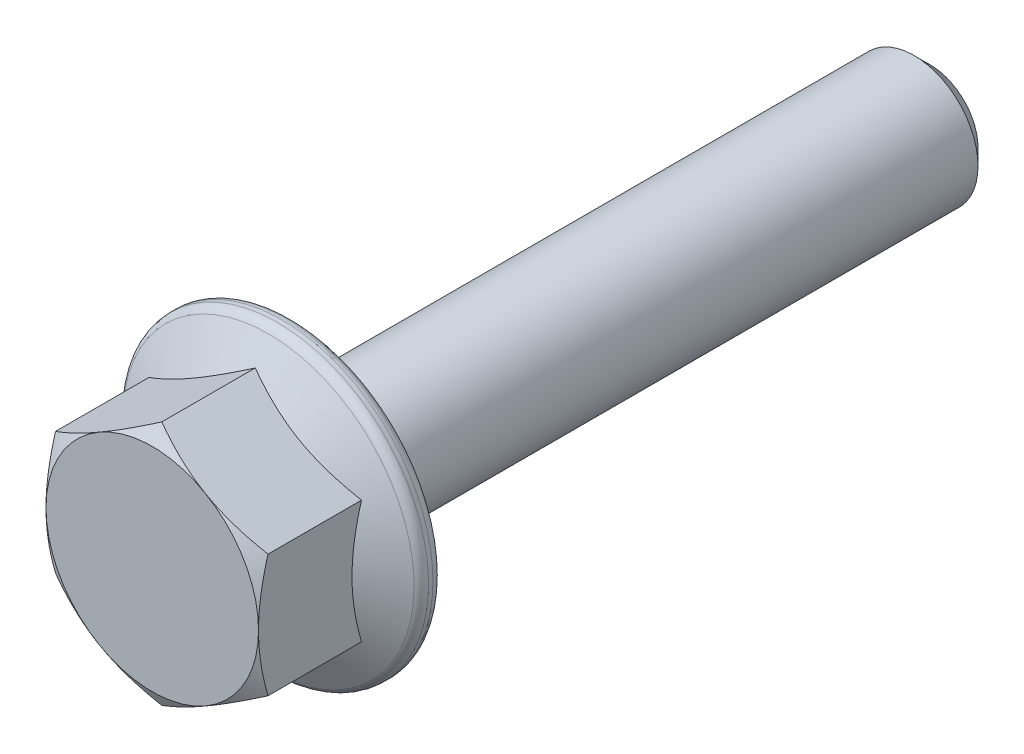
ISO-10303-21;
HEADER;
FILE_DESCRIPTION(('STEP AP214'),'2;1');
FILE_NAME('part.step','',(''),(''),'','','');
FILE_SCHEMA(('AUTOMOTIVE_DESIGN { 1 0 10303 214 1 1 1 1 }'));
ENDSEC;
DATA;
#1=APPLICATION_CONTEXT('core data for automotive mechanical design processes');
#2=APPLICATION_PROTOCOL_DEFINITION('international standard','automotive_design',2000,#1);
#3=PRODUCT_CONTEXT('',#1,'mechanical');
#4=PRODUCT('Part','Part','',(#3));
#5=PRODUCT_RELATED_PRODUCT_CATEGORY('part','',(#4));
#6=PRODUCT_DEFINITION_FORMATION('','',#4);
#7=PRODUCT_DEFINITION_CONTEXT('part definition',#1,'design');
#8=PRODUCT_DEFINITION('design','',#6,#7);
#9=PRODUCT_DEFINITION_SHAPE('','',#8);
#10=(LENGTH_UNIT() NAMED_UNIT(*) SI_UNIT(.MILLI.,.METRE.));
#11=(NAMED_UNIT(*) PLANE_ANGLE_UNIT() SI_UNIT($,.RADIAN.));
#12=(NAMED_UNIT(*) SI_UNIT($,.STERADIAN.) SOLID_ANGLE_UNIT());
#13=UNCERTAINTY_MEASURE_WITH_UNIT(LENGTH_MEASURE(1.E-05),#10,'distance_accuracy_value','');
#14=(GEOMETRIC_REPRESENTATION_CONTEXT(3) GLOBAL_UNCERTAINTY_ASSIGNED_CONTEXT((#13)) GLOBAL_UNIT_ASSIGNED_CONTEXT((#10,
#11,#12)) REPRESENTATION_CONTEXT('',''));
#15=CARTESIAN_POINT('',(0.,0.,0.));
#16=DIRECTION('',(0.,0.,1.));
#17=DIRECTION('',(1.,0.,0.));
#18=AXIS2_PLACEMENT_3D('',#15,#16,#17);
#19=CARTESIAN_POINT('',(5.,-2.88675134594813,0.));
#20=DIRECTION('',(0.,0.,1.));
#21=DIRECTION('',(1.,0.,0.));
#22=AXIS2_PLACEMENT_3D('',#19,#20,#21);
#23=PLANE('',#22);
#24=CARTESIAN_POINT('',(0.,0.,0.));
#25=DIRECTION('',(0.,0.,1.));
#26=DIRECTION('',(1.,0.,0.));
#27=AXIS2_PLACEMENT_3D('',#24,#25,#26);
#28=CIRCLE('',#27,6.605);
#29=CARTESIAN_POINT('',(6.605,0.,0.));
#30=VERTEX_POINT('',#29);
#31=EDGE_CURVE('E350',#30,#30,#28,.F.);
#32=ORIENTED_EDGE('',*,*,#31,.T.);
#33=EDGE_LOOP('',(#32));
#34=FACE_BOUND('',#33,.T.);
#35=CARTESIAN_POINT('',(0.,0.,0.));
#36=DIRECTION('',(0.,0.,1.));
#37=DIRECTION('',(1.,0.,0.));
#38=AXIS2_PLACEMENT_3D('',#35,#36,#37);
#39=CIRCLE('',#38,3.);
#40=CARTESIAN_POINT('',(3.,0.,0.));
#41=VERTEX_POINT('',#40);
#42=EDGE_CURVE('E336',#41,#41,#39,.F.);
#43=ORIENTED_EDGE('',*,*,#42,.F.);
#44=EDGE_LOOP('',(#43));
#45=FACE_BOUND('',#44,.T.);
#46=ADVANCED_FACE('F42',(#34,#45),#23,.F.);
#47=CARTESIAN_POINT('',(0.,0.,0.99));
#48=DIRECTION('',(0.,0.,-1.));
#49=DIRECTION('',(-1.,0.,0.));
#50=AXIS2_PLACEMENT_3D('',#47,#48,#49);
#51=CYLINDRICAL_SURFACE('',#50,7.1);
#52=CARTESIAN_POINT('',(0.,0.,0.495));
#53=DIRECTION('',(0.,0.,1.));
#54=DIRECTION('',(1.,0.,0.));
#55=AXIS2_PLACEMENT_3D('',#52,#53,#54);
#56=CIRCLE('',#55,7.1);
#57=CARTESIAN_POINT('',(7.1,0.,0.495));
#58=VERTEX_POINT('',#57);
#59=EDGE_CURVE('E51',#58,#58,#56,.T.);
#60=ORIENTED_EDGE('',*,*,#59,.T.);
#61=EDGE_LOOP('',(#60));
#62=FACE_BOUND('',#61,.T.);
#63=CARTESIAN_POINT('',(0.,0.,0.704211616751135));
#64=DIRECTION('',(0.,0.,-1.));
#65=DIRECTION('',(-1.,0.,0.));
#66=AXIS2_PLACEMENT_3D('',#63,#64,#65);
#67=CIRCLE('',#66,7.1);
#68=CARTESIAN_POINT('',(-7.1,0.,0.704211616751135));
#69=VERTEX_POINT('',#68);
#70=EDGE_CURVE('E353',#69,#69,#67,.T.);
#71=ORIENTED_EDGE('',*,*,#70,.T.);
#72=EDGE_LOOP('',(#71));
#73=FACE_BOUND('',#72,.T.);
#74=ADVANCED_FACE('F239',(#62,#73),#51,.T.);
#75=CARTESIAN_POINT('',(0.,0.,-30.));
#76=DIRECTION('',(0.,0.,1.));
#77=DIRECTION('',(1.,0.,0.));
#78=AXIS2_PLACEMENT_3D('',#75,#76,#77);
#79=PLANE('',#78);
#80=CARTESIAN_POINT('',(0.,0.,-30.));
#81=DIRECTION('',(0.,0.,1.));
#82=DIRECTION('',(1.,0.,0.));
#83=AXIS2_PLACEMENT_3D('',#80,#81,#82);
#84=CIRCLE('',#83,2.25);
#85=CARTESIAN_POINT('',(2.25,0.,-30.));
#86=VERTEX_POINT('',#85);
#87=EDGE_CURVE('E511',#86,#86,#84,.F.);
#88=ORIENTED_EDGE('',*,*,#87,.T.);
#89=EDGE_LOOP('',(#88));
#90=FACE_BOUND('',#89,.T.);
#91=ADVANCED_FACE('F283',(#90),#79,.F.);
#92=CARTESIAN_POINT('',(0.,0.,-30.));
#93=DIRECTION('',(0.,0.,1.));
#94=DIRECTION('',(1.,0.,0.));
#95=AXIS2_PLACEMENT_3D('',#92,#93,#94);
#96=CYLINDRICAL_SURFACE('',#95,3.);
#97=ORIENTED_EDGE('',*,*,#42,.T.);
#98=EDGE_LOOP('',(#97));
#99=FACE_BOUND('',#98,.T.);
#100=CARTESIAN_POINT('',(0.,0.,-29.25));
#101=DIRECTION('',(0.,0.,1.));
#102=DIRECTION('',(1.,0.,0.));
#103=AXIS2_PLACEMENT_3D('',#100,#101,#102);
#104=CIRCLE('',#103,3.);
#105=CARTESIAN_POINT('',(3.,0.,-29.25));
#106=VERTEX_POINT('',#105);
#107=EDGE_CURVE('E514',#106,#106,#104,.T.);
#108=ORIENTED_EDGE('',*,*,#107,.T.);
#109=EDGE_LOOP('',(#108));
#110=FACE_BOUND('',#109,.T.);
#111=ADVANCED_FACE('F166',(#99,#110),#96,.T.);
#112=CARTESIAN_POINT('',(0.,0.,-29.25));
#113=DIRECTION('',(0.,0.,1.));
#114=DIRECTION('',(1.,0.,0.));
#115=AXIS2_PLACEMENT_3D('',#112,#113,#114);
#116=CONICAL_SURFACE('',#115,3.,0.785398163397449);
#117=ORIENTED_EDGE('',*,*,#87,.F.);
#118=EDGE_LOOP('',(#117));
#119=FACE_BOUND('',#118,.T.);
#120=ORIENTED_EDGE('',*,*,#107,.F.);
#121=EDGE_LOOP('',(#120));
#122=FACE_BOUND('',#121,.T.);
#123=ADVANCED_FACE('F164',(#119,#122),#116,.T.);
#124=CARTESIAN_POINT('',(0.,0.,0.99));
#125=DIRECTION('',(0.,0.,-1.));
#126=DIRECTION('',(1.,0.,0.));
#127=AXIS2_PLACEMENT_3D('',#124,#125,#126);
#128=CONICAL_SURFACE('',#127,7.1,1.0471975511966);
#129=CARTESIAN_POINT('',(0.,0.,1.13289419162443));
#130=DIRECTION('',(0.,0.,-1.));
#131=DIRECTION('',(-1.,0.,0.));
#132=AXIS2_PLACEMENT_3D('',#129,#130,#131);
#133=CIRCLE('',#132,6.8525);
#134=CARTESIAN_POINT('',(-6.8525,0.,1.13289419162443));
#135=VERTEX_POINT('',#134);
#136=EDGE_CURVE('E12',#135,#135,#133,.F.);
#137=ORIENTED_EDGE('',*,*,#136,.T.);
#138=EDGE_LOOP('',(#137));
#139=FACE_BOUND('',#138,.T.);
#140=CARTESIAN_POINT('',(5.,-7.70171820680636,-0.212273998636657));
#141=CARTESIAN_POINT('',(5.,-7.48371447646161,-0.106734717112685));
#142=CARTESIAN_POINT('',(5.,-7.26520450424519,-0.0022229251631863));
#143=CARTESIAN_POINT('',(5.,-6.8269025412551,0.204166509530027));
#144=CARTESIAN_POINT('',(5.,-6.60711034992659,0.306043725876509));
#145=CARTESIAN_POINT('',(5.,-6.1648171866127,0.507108387813601));
#146=CARTESIAN_POINT('',(5.,-5.94230794712741,0.606277710799799));
#147=CARTESIAN_POINT('',(5.,-5.49550054936903,0.800485404375952));
#148=CARTESIAN_POINT('',(5.,-5.27120247796644,0.895523974138073));
#149=CARTESIAN_POINT('',(5.,-4.81354137707359,1.08321501931591));
#150=CARTESIAN_POINT('',(5.,-4.58011130522733,1.17570492548981));
#151=CARTESIAN_POINT('',(5.,-4.11050120983856,1.35355683778659));
#152=CARTESIAN_POINT('',(5.,-3.8743208785309,1.43891803727243));
#153=CARTESIAN_POINT('',(5.,-3.3992933604217,1.60023398047267));
#154=CARTESIAN_POINT('',(5.,-3.1604528555511,1.6762082000866));
#155=CARTESIAN_POINT('',(5.,-2.6793473146327,1.8162783463246));
#156=CARTESIAN_POINT('',(5.,-2.43708339928788,1.8803780675313));
#157=CARTESIAN_POINT('',(5.,-1.95026796729562,1.99326604883031));
#158=CARTESIAN_POINT('',(5.,-1.70573474373274,2.0421317275487));
#159=CARTESIAN_POINT('',(5.,-1.21368437348609,2.12173164280274));
#160=CARTESIAN_POINT('',(5.,-0.96616751023231,2.15246758793047));
#161=CARTESIAN_POINT('',(5.,-0.472597902685094,2.19295289158222));
#162=CARTESIAN_POINT('',(5.,-0.226567511674905,2.20296807199916));
#163=CARTESIAN_POINT('',(5.,0.265466884600938,2.2018593774913));
#164=CARTESIAN_POINT('',(5.,0.511470888568317,2.19073472744314));
#165=CARTESIAN_POINT('',(5.,0.930593929624013,2.15455157716298));
#166=CARTESIAN_POINT('',(5.,1.10416727822158,2.1344675460135));
#167=CARTESIAN_POINT('',(5.,1.4500019226071,2.08505346989829));
#168=CARTESIAN_POINT('',(5.,1.62226303106724,2.0557221292654));
#169=CARTESIAN_POINT('',(5.,2.13686448014456,1.95540338682575));
#170=CARTESIAN_POINT('',(5.,2.47683032272226,1.87211005861612));
#171=CARTESIAN_POINT('',(5.,2.9852924219486,1.72816150260356));
#172=CARTESIAN_POINT('',(5.,3.15643331927305,1.6763209069459));
#173=CARTESIAN_POINT('',(5.,3.49705069568681,1.5673851864987));
#174=CARTESIAN_POINT('',(5.,3.66652716271324,1.51029002365791));
#175=CARTESIAN_POINT('',(5.,4.00387435609743,1.39175094562261));
#176=CARTESIAN_POINT('',(5.,4.17174560324943,1.33030849922685));
#177=CARTESIAN_POINT('',(5.,4.5061034494463,1.20378501750928));
#178=CARTESIAN_POINT('',(5.,4.67259007445492,1.13870405059277));
#179=CARTESIAN_POINT('',(5.,5.1052607424884,0.964996650317399));
#180=CARTESIAN_POINT('',(5.,5.37047839191152,0.853965936328499));
#181=CARTESIAN_POINT('',(5.,5.89837174428201,0.625998387878282));
#182=CARTESIAN_POINT('',(5.,6.16104721755945,0.509061025614777));
#183=CARTESIAN_POINT('',(5.,6.68440643631685,0.270630627228389));
#184=CARTESIAN_POINT('',(5.,6.94508959300766,0.149136302633067));
#185=CARTESIAN_POINT('',(5.,7.46478995692088,-0.0973714657764252));
#186=CARTESIAN_POINT('',(5.,7.72380712045051,-0.222385001427781));
#187=CARTESIAN_POINT('',(5.,8.24082980568644,-0.475356171054078));
#188=CARTESIAN_POINT('',(5.,8.49883349404381,-0.603317544977937));
#189=CARTESIAN_POINT('',(5.,9.01372375142724,-0.861470592477799));
#190=CARTESIAN_POINT('',(5.,9.27061030984767,-0.991662287169942));
#191=CARTESIAN_POINT('',(5.,10.0398008906673,-1.38487592990517));
#192=CARTESIAN_POINT('',(5.,10.5507314385059,-1.65058364477311));
#193=CARTESIAN_POINT('',(5.,11.5196330016532,-2.16032993585003));
#194=CARTESIAN_POINT('',(5.,11.9778447606495,-2.40391300966252));
#195=CARTESIAN_POINT('',(5.,12.8927358525534,-2.89399372912938));
#196=CARTESIAN_POINT('',(5.,13.3494151069724,-3.14049152122468));
#197=CARTESIAN_POINT('',(5.,14.2602606266051,-3.63493653338174));
#198=CARTESIAN_POINT('',(5.,14.7144303358757,-3.88287741859901));
#199=CARTESIAN_POINT('',(5.,15.621810818578,-4.38043638328299));
#200=CARTESIAN_POINT('',(5.,16.0750216543522,-4.63005434901193));
#201=CARTESIAN_POINT('',(4.99999999999999,16.5278911569616,-4.88028626267091));
#202=B_SPLINE_CURVE_WITH_KNOTS('',3,(#140,#141,#142,#143,#144,#145,#146,#147,#148,#149,#150,
#151,#152,#153,#154,#155,#156,#157,#158,#159,#160,#161,#162,#163,#164,#165,#166,#167,#168,#169,
#170,#171,#172,#173,#174,#175,#176,#177,#178,#179,#180,#181,#182,#183,#184,#185,#186,#187,#188,
#189,#190,#191,#192,#193,#194,#195,#196,#197,#198,#199,#200,#201),.UNSPECIFIED.,.F.,.F.,(4,2,2,
2,2,2,2,2,2,2,2,2,2,2,2,2,2,2,2,2,2,2,2,2,2,2,2,2,2,2,4),(0.,0.726629750758625,1.45337637727813,
2.18416715333241,2.91492265373328,3.66808951826182,4.42134149099835,5.17300340974894,
5.92442471353423,6.67196262150821,7.41943006835242,8.1572474231587,8.89509183165973,
9.41903123814847,9.94304408794653,10.9916477783613,11.5280644485325,12.0644850035007,
12.6007251778431,13.1369552740947,13.9994130897102,14.8619481090422,15.7247288746942,
16.5875321763472,17.4514980295122,18.315472067023,20.043100259285,21.5998863147047,
23.1567509211538,24.7090690647452,26.2612829736388),.UNSPECIFIED.);
#203=CARTESIAN_POINT('',(5.,2.88675134594813,1.75585357791301));
#204=VERTEX_POINT('',#203);
#205=CARTESIAN_POINT('',(5.,-2.88675134594813,1.755853577913));
#206=VERTEX_POINT('',#205);
#207=EDGE_CURVE('E65',#204,#206,#202,.F.);
#208=ORIENTED_EDGE('',*,*,#207,.T.);
#209=CARTESIAN_POINT('',(5.0002,-2.88663587589429,1.75578690924638));
#210=CARTESIAN_POINT('',(4.78046540547482,-3.01349970319368,1.82904899766057));
#211=CARTESIAN_POINT('',(4.55885141554042,-3.14144859993849,1.89568424338011));
#212=CARTESIAN_POINT('',(4.11178600454649,-3.39956193532121,2.0119965742874));
#213=CARTESIAN_POINT('',(3.88632664040923,-3.52973095989718,2.06163251538242));
#214=CARTESIAN_POINT('',(3.43816769477649,-3.78847564779798,2.13888453987951));
#215=CARTESIAN_POINT('',(3.21553790689581,-3.91701101576052,2.16701518701472));
#216=CARTESIAN_POINT('',(2.88081009815336,-4.11026620624323,2.19224064334452));
#217=CARTESIAN_POINT('',(2.76915780319494,-4.17472868879311,2.19782210552872));
#218=CARTESIAN_POINT('',(2.5457500293262,-4.30371322717528,2.20323334854674));
#219=CARTESIAN_POINT('',(2.43399455370968,-4.36823528110589,2.20306330704));
#220=CARTESIAN_POINT('',(2.12781576914936,-4.54500768479195,2.19468193350617));
#221=CARTESIAN_POINT('',(1.93349391403278,-4.65719946015293,2.18060579340095));
#222=CARTESIAN_POINT('',(1.54613989800229,-4.88083840557981,2.13597030818877));
#223=CARTESIAN_POINT('',(1.35310909862843,-4.9922847895602,2.1053957051507));
#224=CARTESIAN_POINT('',(0.964974657525144,-5.21637431361295,2.02896707167704));
#225=CARTESIAN_POINT('',(0.769920001358262,-5.32898917185759,1.98278918641953));
#226=CARTESIAN_POINT('',(0.38271965464123,-5.55253939626498,1.87798377080627));
#227=CARTESIAN_POINT('',(0.190569004591912,-5.66347762579592,1.81938086186083));
#228=CARTESIAN_POINT('',(-0.000200000000001429,-5.7736181619501,1.75578690924638));
#229=B_SPLINE_CURVE_WITH_KNOTS('',3,(#209,#210,#211,#212,#213,#214,#215,#216,#217,#218,#219,
#220,#221,#222,#223,#224,#225,#226,#227,#228),.UNSPECIFIED.,.F.,.F.,(4,2,2,2,2,2,2,2,2,4),(0.,
0.792555841363091,1.58701660053334,2.36181537487281,2.74884076077326,3.13585419177295,
3.80962362599679,4.48401723901189,5.17336882348929,5.86136694793725),.UNSPECIFIED.);
#230=CARTESIAN_POINT('',(0.,-5.77350269189626,1.755853577913));
#231=VERTEX_POINT('',#230);
#232=EDGE_CURVE('E58',#206,#231,#229,.T.);
#233=ORIENTED_EDGE('',*,*,#232,.T.);
#234=CARTESIAN_POINT('',(0.000199999999998397,-5.7736181619501,1.75578690924638));
#235=CARTESIAN_POINT('',(-0.219534594525187,-5.64675433465071,1.82904899766057));
#236=CARTESIAN_POINT('',(-0.441148584459582,-5.5188054379059,1.89568424338012));
#237=CARTESIAN_POINT('',(-0.888213995453515,-5.26069210252318,2.0119965742874));
#238=CARTESIAN_POINT('',(-1.11367335959078,-5.13052307794721,2.06163251538242));
#239=CARTESIAN_POINT('',(-1.56183230522351,-4.87177839004641,2.13888453987951));
#240=CARTESIAN_POINT('',(-1.7844620931042,-4.74324302208387,2.16701518701472));
#241=CARTESIAN_POINT('',(-2.11918990184664,-4.54998783160116,2.19224064334452));
#242=CARTESIAN_POINT('',(-2.23084219680506,-4.48552534905128,2.19782210552872));
#243=CARTESIAN_POINT('',(-2.4542499706738,-4.35654081066911,2.20323334854674));
#244=CARTESIAN_POINT('',(-2.56600544629032,-4.2920187567385,2.20306330704));
#245=CARTESIAN_POINT('',(-2.87218423085064,-4.11524635305244,2.19468193350617));
#246=CARTESIAN_POINT('',(-3.06650608596722,-4.00305457769146,2.18060579340095));
#247=CARTESIAN_POINT('',(-3.45386010199771,-3.77941563226457,2.13597030818877));
#248=CARTESIAN_POINT('',(-3.64689090137157,-3.66796924828419,2.1053957051507));
#249=CARTESIAN_POINT('',(-4.03502534247486,-3.44387972423144,2.02896707167704));
#250=CARTESIAN_POINT('',(-4.23007999864174,-3.3312648659868,1.98278918641953));
#251=CARTESIAN_POINT('',(-4.61728034535877,-3.10771464157941,1.87798377080627));
#252=CARTESIAN_POINT('',(-4.80943099540809,-2.99677641204847,1.81938086186083));
#253=CARTESIAN_POINT('',(-5.0002,-2.88663587589429,1.75578690924638));
#254=B_SPLINE_CURVE_WITH_KNOTS('',3,(#234,#235,#236,#237,#238,#239,#240,#241,#242,#243,#244,
#245,#246,#247,#248,#249,#250,#251,#252,#253),.UNSPECIFIED.,.F.,.F.,(4,2,2,2,2,2,2,2,2,4),(0.,
0.792555841363091,1.58701660053334,2.36181537487281,2.74884076077326,3.13585419177295,
3.80962362599679,4.48401723901189,5.17336882348929,5.86136694793725),.UNSPECIFIED.);
#255=CARTESIAN_POINT('',(-5.,-2.88675134594813,1.755853577913));
#256=VERTEX_POINT('',#255);
#257=EDGE_CURVE('E122',#231,#256,#254,.T.);
#258=ORIENTED_EDGE('',*,*,#257,.T.);
#259=CARTESIAN_POINT('',(-5.,-7.70171820680231,-0.212273998634693));
#260=CARTESIAN_POINT('',(-5.,-7.48371447645769,-0.106734717110803));
#261=CARTESIAN_POINT('',(-5.,-7.26520450424141,-0.00222292516138663));
#262=CARTESIAN_POINT('',(-5.,-6.82690254125159,0.204166509531662));
#263=CARTESIAN_POINT('',(-5.,-6.60711034992322,0.306043725878062));
#264=CARTESIAN_POINT('',(-5.,-6.16481718660961,0.50710838781499));
#265=CARTESIAN_POINT('',(-5.,-5.94230794712445,0.606277710801106));
#266=CARTESIAN_POINT('',(-5.,-5.49550054936635,0.800485404377096));
#267=CARTESIAN_POINT('',(-5.,-5.2712024779639,0.895523974139137));
#268=CARTESIAN_POINT('',(-5.,-4.81354137707133,1.08321501931681));
#269=CARTESIAN_POINT('',(-5.,-4.58011130522523,1.17570492549063));
#270=CARTESIAN_POINT('',(-5.,-4.11050120983676,1.35355683778725));
#271=CARTESIAN_POINT('',(-5.,-3.87432087852925,1.43891803727301));
#272=CARTESIAN_POINT('',(-5.,-3.39929336042036,1.60023398047311));
#273=CARTESIAN_POINT('',(-5.,-3.16045285554992,1.67620820008697));
#274=CARTESIAN_POINT('',(-5.,-2.67934731463183,1.81627834632484));
#275=CARTESIAN_POINT('',(-5.,-2.43708339928717,1.88037806753148));
#276=CARTESIAN_POINT('',(-5.,-1.95026796729531,1.99326604883037));
#277=CARTESIAN_POINT('',(-5.,-1.70573474373268,2.04213172754871));
#278=CARTESIAN_POINT('',(-5.,-1.21368437348653,2.12173164280267));
#279=CARTESIAN_POINT('',(-5.,-0.966167510232992,2.15246758793039));
#280=CARTESIAN_POINT('',(-5.,-0.472597902686273,2.19295289158215));
#281=CARTESIAN_POINT('',(-5.,-0.226567511676331,2.20296807199911));
#282=CARTESIAN_POINT('',(-5.,0.265466884599024,2.20185937749135));
#283=CARTESIAN_POINT('',(-5.,0.511470888566162,2.19073472744325));
#284=CARTESIAN_POINT('',(-5.,0.930593929621551,2.15455157716324));
#285=CARTESIAN_POINT('',(-5.,1.10416727821905,2.13446754601381));
#286=CARTESIAN_POINT('',(-5.,1.45000192260444,2.08505346989872));
#287=CARTESIAN_POINT('',(-5.,1.6222630310645,2.05572212926588));
#288=CARTESIAN_POINT('',(-5.,2.13686448014163,1.95540338682642));
#289=CARTESIAN_POINT('',(-5.,2.47683032271921,1.8721100586169));
#290=CARTESIAN_POINT('',(-5.,2.98529242194537,1.72816150260451));
#291=CARTESIAN_POINT('',(-5.,3.15643331926975,1.67632090694691));
#292=CARTESIAN_POINT('',(-5.,3.49705069568339,1.56738518649983));
#293=CARTESIAN_POINT('',(-5.,3.66652716270975,1.5102900236591));
#294=CARTESIAN_POINT('',(-5.,4.00387435609382,1.39175094562391));
#295=CARTESIAN_POINT('',(-5.,4.17174560324576,1.3303084992282));
#296=CARTESIAN_POINT('',(-5.,4.5061034494425,1.20378501751075));
#297=CARTESIAN_POINT('',(-5.,4.67259007445106,1.13870405059429));
#298=CARTESIAN_POINT('',(-5.,5.1052607424845,0.964996650319008));
#299=CARTESIAN_POINT('',(-5.,5.37047839190764,0.853965936330138));
#300=CARTESIAN_POINT('',(-5.,5.89837174427818,0.625998387879972));
#301=CARTESIAN_POINT('',(-5.,6.16104721755563,0.509061025616488));
#302=CARTESIAN_POINT('',(-5.,6.68440643631307,0.270630627230137));
#303=CARTESIAN_POINT('',(-5.,6.9450895930039,0.149136302634831));
#304=CARTESIAN_POINT('',(-5.,7.46478995691715,-0.0973714657746367));
#305=CARTESIAN_POINT('',(-5.,7.7238071204468,-0.222385001425983));
#306=CARTESIAN_POINT('',(-5.,8.24082980568275,-0.475356171052263));
#307=CARTESIAN_POINT('',(-5.,8.49883349404014,-0.603317544976113));
#308=CARTESIAN_POINT('',(-5.,9.0137237514236,-0.861470592475963));
#309=CARTESIAN_POINT('',(-5.,9.27061030984404,-0.991662287168101));
#310=CARTESIAN_POINT('',(-5.,10.0398008906637,-1.38487592990331));
#311=CARTESIAN_POINT('',(-5.,10.5507314385023,-1.65058364477126));
#312=CARTESIAN_POINT('',(-5.,11.5196330016497,-2.16032993584816));
#313=CARTESIAN_POINT('',(-5.,11.977844760646,-2.40391300966063));
#314=CARTESIAN_POINT('',(-5.,12.8927358525499,-2.89399372912747));
#315=CARTESIAN_POINT('',(-5.,13.3494151069689,-3.14049152122276));
#316=CARTESIAN_POINT('',(-5.,14.2602606266015,-3.63493653337981));
#317=CARTESIAN_POINT('',(-5.,14.7144303358722,-3.88287741859707));
#318=CARTESIAN_POINT('',(-5.,15.6218108185744,-4.38043638328103));
#319=CARTESIAN_POINT('',(-5.,16.0750216543486,-4.63005434900996));
#320=CARTESIAN_POINT('',(-5.,16.527891156958,-4.88028626266894));
#321=B_SPLINE_CURVE_WITH_KNOTS('',3,(#259,#260,#261,#262,#263,#264,#265,#266,#267,#268,#269,
#270,#271,#272,#273,#274,#275,#276,#277,#278,#279,#280,#281,#282,#283,#284,#285,#286,#287,#288,
#289,#290,#291,#292,#293,#294,#295,#296,#297,#298,#299,#300,#301,#302,#303,#304,#305,#306,#307,
#308,#309,#310,#311,#312,#313,#314,#315,#316,#317,#318,#319,#320),.UNSPECIFIED.,.F.,.F.,(4,2,2,
2,2,2,2,2,2,2,2,2,2,2,2,2,2,2,2,2,2,2,2,2,2,2,2,2,2,2,4),(0.,0.726629750758149,1.45337637727718,
2.18416715333098,2.91492265373136,3.6680895182594,4.42134149099542,5.1730034097455,
5.92442471353028,6.67196262150352,7.41943006834698,8.15724742315253,8.89509183165283,
9.41903123814134,9.94304408793918,10.9916477783535,11.5280644485245,12.0644850034925,
12.6007251778346,13.136955274086,13.9994130897015,14.8619481090335,15.7247288746856,
16.5875321763385,17.4514980295036,18.3154720670144,20.0431002592765,21.5998863146962,
23.1567509211453,24.7090690647367,26.2612829736302),.UNSPECIFIED.);
#322=CARTESIAN_POINT('',(-5.,2.88675134594813,1.755853577913));
#323=VERTEX_POINT('',#322);
#324=EDGE_CURVE('E134',#256,#323,#321,.T.);
#325=ORIENTED_EDGE('',*,*,#324,.T.);
#326=CARTESIAN_POINT('',(-5.0002,2.88663587589429,1.75578690924638));
#327=CARTESIAN_POINT('',(-4.78046540547482,3.01349970319368,1.82904899766057));
#328=CARTESIAN_POINT('',(-4.55885141554042,3.14144859993849,1.89568424338011));
#329=CARTESIAN_POINT('',(-4.11178600454649,3.39956193532121,2.0119965742874));
#330=CARTESIAN_POINT('',(-3.88632664040923,3.52973095989718,2.06163251538242));
#331=CARTESIAN_POINT('',(-3.43816769477649,3.78847564779798,2.13888453987951));
#332=CARTESIAN_POINT('',(-3.21553790689581,3.91701101576052,2.16701518701472));
#333=CARTESIAN_POINT('',(-2.88081009815336,4.11026620624323,2.19224064334452));
#334=CARTESIAN_POINT('',(-2.76915780319494,4.17472868879311,2.19782210552872));
#335=CARTESIAN_POINT('',(-2.5457500293262,4.30371322717528,2.20323334854674));
#336=CARTESIAN_POINT('',(-2.43399455370969,4.36823528110589,2.20306330704));
#337=CARTESIAN_POINT('',(-2.12781576914936,4.54500768479195,2.19468193350617));
#338=CARTESIAN_POINT('',(-1.93349391403279,4.65719946015293,2.18060579340095));
#339=CARTESIAN_POINT('',(-1.5461398980023,4.88083840557981,2.13597030818877));
#340=CARTESIAN_POINT('',(-1.35310909862843,4.9922847895602,2.1053957051507));
#341=CARTESIAN_POINT('',(-0.964974657525147,5.21637431361295,2.02896707167704));
#342=CARTESIAN_POINT('',(-0.769920001358266,5.32898917185759,1.98278918641953));
#343=CARTESIAN_POINT('',(-0.382719654641233,5.55253939626498,1.87798377080627));
#344=CARTESIAN_POINT('',(-0.190569004591915,5.66347762579592,1.81938086186083));
#345=CARTESIAN_POINT('',(0.000199999999998292,5.7736181619501,1.75578690924638));
#346=B_SPLINE_CURVE_WITH_KNOTS('',3,(#326,#327,#328,#329,#330,#331,#332,#333,#334,#335,#336,
#337,#338,#339,#340,#341,#342,#343,#344,#345),.UNSPECIFIED.,.F.,.F.,(4,2,2,2,2,2,2,2,2,4),(0.,
0.792555841363091,1.58701660053334,2.36181537487281,2.74884076077326,3.13585419177295,
3.80962362599679,4.48401723901189,5.17336882348929,5.86136694793725),.UNSPECIFIED.);
#347=CARTESIAN_POINT('',(0.,5.77350269189626,1.755853577913));
#348=VERTEX_POINT('',#347);
#349=EDGE_CURVE('E141',#323,#348,#346,.T.);
#350=ORIENTED_EDGE('',*,*,#349,.T.);
#351=CARTESIAN_POINT('',(-0.000200000000001604,5.7736181619501,1.75578690924638));
#352=CARTESIAN_POINT('',(0.219534594525183,5.64675433465071,1.82904899766057));
#353=CARTESIAN_POINT('',(0.441148584459579,5.5188054379059,1.89568424338011));
#354=CARTESIAN_POINT('',(0.888213995453512,5.26069210252318,2.0119965742874));
#355=CARTESIAN_POINT('',(1.11367335959077,5.13052307794721,2.06163251538242));
#356=CARTESIAN_POINT('',(1.56183230522351,4.87177839004641,2.13888453987951));
#357=CARTESIAN_POINT('',(1.78446209310419,4.74324302208387,2.16701518701472));
#358=CARTESIAN_POINT('',(2.11918990184664,4.54998783160116,2.19224064334452));
#359=CARTESIAN_POINT('',(2.23084219680506,4.48552534905128,2.19782210552872));
#360=CARTESIAN_POINT('',(2.4542499706738,4.35654081066911,2.20323334854674));
#361=CARTESIAN_POINT('',(2.56600544629031,4.2920187567385,2.20306330704));
#362=CARTESIAN_POINT('',(2.87218423085064,4.11524635305244,2.19468193350617));
#363=CARTESIAN_POINT('',(3.06650608596721,4.00305457769146,2.18060579340095));
#364=CARTESIAN_POINT('',(3.45386010199771,3.77941563226458,2.13597030818878));
#365=CARTESIAN_POINT('',(3.64689090137157,3.66796924828419,2.1053957051507));
#366=CARTESIAN_POINT('',(4.03502534247485,3.44387972423144,2.02896707167704));
#367=CARTESIAN_POINT('',(4.23007999864174,3.3312648659868,1.98278918641953));
#368=CARTESIAN_POINT('',(4.61728034535877,3.10771464157941,1.87798377080627));
#369=CARTESIAN_POINT('',(4.80943099540809,2.99677641204847,1.81938086186083));
#370=CARTESIAN_POINT('',(5.0002,2.88663587589429,1.75578690924638));
#371=B_SPLINE_CURVE_WITH_KNOTS('',3,(#351,#352,#353,#354,#355,#356,#357,#358,#359,#360,#361,
#362,#363,#364,#365,#366,#367,#368,#369,#370),.UNSPECIFIED.,.F.,.F.,(4,2,2,2,2,2,2,2,2,4),(0.,
0.792555841363091,1.58701660053334,2.36181537487281,2.74884076077326,3.13585419177295,
3.80962362599679,4.48401723901189,5.17336882348929,5.86136694793725),.UNSPECIFIED.);
#372=EDGE_CURVE('E180',#348,#204,#371,.T.);
#373=ORIENTED_EDGE('',*,*,#372,.T.);
#374=EDGE_LOOP('',(#208,#233,#258,#325,#350,#373));
#375=FACE_BOUND('',#374,.T.);
#376=ADVANCED_FACE('F143',(#139,#375),#128,.T.);
#377=CARTESIAN_POINT('',(5.,-2.88675134594813,6.6));
#378=DIRECTION('',(0.,0.,1.));
#379=DIRECTION('',(1.,0.,0.));
#380=AXIS2_PLACEMENT_3D('',#377,#378,#379);
#381=PLANE('',#380);
#382=CARTESIAN_POINT('',(0.,0.,6.6));
#383=DIRECTION('',(0.,0.,1.));
#384=DIRECTION('',(1.,0.,0.));
#385=AXIS2_PLACEMENT_3D('',#382,#383,#384);
#386=CIRCLE('',#385,5.);
#387=CARTESIAN_POINT('',(2.5,-4.3301270189222,6.6));
#388=VERTEX_POINT('',#387);
#389=CARTESIAN_POINT('',(5.,0.,6.6));
#390=VERTEX_POINT('',#389);
#391=EDGE_CURVE('E298',#388,#390,#386,.T.);
#392=ORIENTED_EDGE('',*,*,#391,.T.);
#393=CARTESIAN_POINT('',(0.,0.,6.6));
#394=DIRECTION('',(0.,0.,1.));
#395=DIRECTION('',(1.,0.,0.));
#396=AXIS2_PLACEMENT_3D('',#393,#394,#395);
#397=CIRCLE('',#396,5.);
#398=CARTESIAN_POINT('',(2.5,4.33012701892219,6.6));
#399=VERTEX_POINT('',#398);
#400=EDGE_CURVE('E301',#390,#399,#397,.T.);
#401=ORIENTED_EDGE('',*,*,#400,.T.);
#402=CARTESIAN_POINT('',(-2.5,4.33012701892219,6.6));
#403=VERTEX_POINT('',#402);
#404=EDGE_CURVE('E310',#399,#403,#386,.T.);
#405=ORIENTED_EDGE('',*,*,#404,.T.);
#406=CARTESIAN_POINT('',(-5.,0.,6.6));
#407=VERTEX_POINT('',#406);
#408=EDGE_CURVE('E330',#403,#407,#386,.T.);
#409=ORIENTED_EDGE('',*,*,#408,.T.);
#410=CARTESIAN_POINT('',(-2.5,-4.3301270189222,6.6));
#411=VERTEX_POINT('',#410);
#412=EDGE_CURVE('E334',#407,#411,#386,.T.);
#413=ORIENTED_EDGE('',*,*,#412,.T.);
#414=EDGE_CURVE('E304',#411,#388,#386,.T.);
#415=ORIENTED_EDGE('',*,*,#414,.T.);
#416=EDGE_LOOP('',(#392,#401,#405,#409,#413,#415));
#417=FACE_BOUND('',#416,.T.);
#418=ADVANCED_FACE('F163',(#417),#381,.T.);
#419=CARTESIAN_POINT('',(0.,0.,6.6));
#420=DIRECTION('',(0.,0.,-1.));
#421=DIRECTION('',(1.,0.,0.));
#422=AXIS2_PLACEMENT_3D('',#419,#420,#421);
#423=CONICAL_SURFACE('',#422,5.,1.0471975511966);
#424=CARTESIAN_POINT('',(-0.000200000000001603,-5.7736181619501,6.15335134394817));
#425=CARTESIAN_POINT('',(0.219534594525184,-5.64675433465071,6.22661343236236));
#426=CARTESIAN_POINT('',(0.441148584459579,-5.5188054379059,6.29324867808191));
#427=CARTESIAN_POINT('',(0.888213995453512,-5.26069210252318,6.40956100898919));
#428=CARTESIAN_POINT('',(1.11367335959077,-5.13052307794721,6.45919695008421));
#429=CARTESIAN_POINT('',(1.56183230522351,-4.87177839004641,6.5364489745813));
#430=CARTESIAN_POINT('',(1.78446209310419,-4.74324302208387,6.56457962171651));
#431=CARTESIAN_POINT('',(2.11918990184664,-4.54998783160116,6.58980507804631));
#432=CARTESIAN_POINT('',(2.23084219680506,-4.48552534905128,6.59538654023052));
#433=CARTESIAN_POINT('',(2.4542499706738,-4.35654081066911,6.60079778324853));
#434=CARTESIAN_POINT('',(2.56600544629031,-4.2920187567385,6.6006277417418));
#435=CARTESIAN_POINT('',(2.87218423085064,-4.11524635305244,6.59224636820796));
#436=CARTESIAN_POINT('',(3.06650608596721,-4.00305457769146,6.57817022810275));
#437=CARTESIAN_POINT('',(3.45386010199771,-3.77941563226458,6.53353474289057));
#438=CARTESIAN_POINT('',(3.64689090137157,-3.66796924828419,6.50296013985249));
#439=CARTESIAN_POINT('',(4.03502534247485,-3.44387972423144,6.42653150637883));
#440=CARTESIAN_POINT('',(4.23007999864174,-3.3312648659868,6.38035362112132));
#441=CARTESIAN_POINT('',(4.61728034535877,-3.10771464157941,6.27554820550807));
#442=CARTESIAN_POINT('',(4.80943099540809,-2.99677641204847,6.21694529656263));
#443=CARTESIAN_POINT('',(5.0002,-2.88663587589429,6.15335134394817));
#444=B_SPLINE_CURVE_WITH_KNOTS('',3,(#424,#425,#426,#427,#428,#429,#430,#431,#432,#433,#434,
#435,#436,#437,#438,#439,#440,#441,#442,#443),.UNSPECIFIED.,.F.,.F.,(4,2,2,2,2,2,2,2,2,4),(0.,
0.792555841363092,1.58701660053333,2.36181537487281,2.74884076077326,3.13585419177295,
3.80962362599679,4.48401723901189,5.17336882348929,5.86136694793725),.UNSPECIFIED.);
#445=CARTESIAN_POINT('',(5.,-2.88675134594869,6.15341801261517));
#446=VERTEX_POINT('',#445);
#447=EDGE_CURVE('E225',#388,#446,#444,.T.);
#448=ORIENTED_EDGE('',*,*,#447,.T.);
#449=CARTESIAN_POINT('',(5.,-7.78947449729548,4.14272312296826));
#450=CARTESIAN_POINT('',(5.,-7.57072341494757,4.24897850327906));
#451=CARTESIAN_POINT('',(5.,-7.35147380429044,4.35422495222534));
#452=CARTESIAN_POINT('',(5.,-6.91171240930025,4.56213300114351));
#453=CARTESIAN_POINT('',(5.,-6.69120043552731,4.66479419997235));
#454=CARTESIAN_POINT('',(5.,-6.24753076416609,4.86747331418384));
#455=CARTESIAN_POINT('',(5.,-6.02436522083893,4.96747411374497));
#456=CARTESIAN_POINT('',(5.,-5.57627064282176,5.16342804737054));
#457=CARTESIAN_POINT('',(5.,-5.35134169118119,5.25938137071292));
#458=CARTESIAN_POINT('',(5.,-4.89211235804164,5.44916872594718));
#459=CARTESIAN_POINT('',(5.,-4.65774274624212,5.54283614584391));
#460=CARTESIAN_POINT('',(5.,-4.18627503731153,5.72316693956401));
#461=CARTESIAN_POINT('',(5.,-3.94917663953014,5.80982953300952));
#462=CARTESIAN_POINT('',(5.,-3.47230592925638,5.97390256970583));
#463=CARTESIAN_POINT('',(5.,-3.23254000734005,6.05133140212221));
#464=CARTESIAN_POINT('',(5.,-2.74956973618955,6.19447636596561));
#465=CARTESIAN_POINT('',(5.,-2.50636648360533,6.2601961459113));
#466=CARTESIAN_POINT('',(5.,-2.01766668699986,6.37645995808733));
#467=CARTESIAN_POINT('',(5.,-1.77218933630353,6.42708319046373));
#468=CARTESIAN_POINT('',(5.,-1.2781466904126,6.51029077993413));
#469=CARTESIAN_POINT('',(5.,-1.02958172357158,6.54287703866569));
#470=CARTESIAN_POINT('',(5.,-0.533865783107727,6.58698650511718));
#471=CARTESIAN_POINT('',(5.,-0.286739768810079,6.5987832960786));
#472=CARTESIAN_POINT('',(5.,0.207635305268515,6.60103606773158));
#473=CARTESIAN_POINT('',(5.,0.454884368815333,6.5914913492612));
#474=CARTESIAN_POINT('',(5.,0.873479005831569,6.55794408795797));
#475=CARTESIAN_POINT('',(5.,1.04526890538861,6.53915855778014));
#476=CARTESIAN_POINT('',(5.,1.38760768565005,6.49243398917471));
#477=CARTESIAN_POINT('',(5.,1.55815639980427,6.4644937446432));
#478=CARTESIAN_POINT('',(5.,2.06769346642203,6.36840817243954));
#479=CARTESIAN_POINT('',(5.,2.40439859024612,6.28801382994174));
#480=CARTESIAN_POINT('',(5.,2.90814743072846,6.14834269197493));
#481=CARTESIAN_POINT('',(5.,3.07779158621485,6.09790957953425));
#482=CARTESIAN_POINT('',(5.,3.41543115451484,5.99174870291964));
#483=CARTESIAN_POINT('',(5.,3.58342655428791,5.93602089690547));
#484=CARTESIAN_POINT('',(5.,3.91782486195704,5.82016990358352));
#485=CARTESIAN_POINT('',(5.,4.0842282293521,5.76004803061821));
#486=CARTESIAN_POINT('',(5.,4.415648617851,5.63612209603194));
#487=CARTESIAN_POINT('',(5.,4.5806656755223,5.57231813188715));
#488=CARTESIAN_POINT('',(5.,5.0456497538601,5.38752855308046));
#489=CARTESIAN_POINT('',(5.,5.34418838578944,5.26295139162833));
#490=CARTESIAN_POINT('',(5.,5.9380617787815,5.00635367699196));
#491=CARTESIAN_POINT('',(5.,6.23339612884997,4.87433218211644));
#492=CARTESIAN_POINT('',(5.,6.82165168374744,4.60471118867582));
#493=CARTESIAN_POINT('',(5.,7.11457180259797,4.46710932885325));
#494=CARTESIAN_POINT('',(5.,7.69839351209138,4.18773806611515));
#495=CARTESIAN_POINT('',(5.,7.98929519790743,4.04596886137174));
#496=CARTESIAN_POINT('',(5.,8.57000419879236,3.7589708603186));
#497=CARTESIAN_POINT('',(5.,8.85980878315771,3.61373655027133));
#498=CARTESIAN_POINT('',(5.,9.43813603119926,3.32073538840943));
#499=CARTESIAN_POINT('',(5.,9.72665868221635,3.17296851165532));
#500=CARTESIAN_POINT('',(5.,10.5905371657489,2.72675059214226));
#501=CARTESIAN_POINT('',(5.,11.1643480372977,2.42531013449816));
#502=CARTESIAN_POINT('',(5.,12.2443046124434,1.85165941549161));
#503=CARTESIAN_POINT('',(5.,12.7507487196582,1.58000825478649));
#504=CARTESIAN_POINT('',(5.,13.7620566758396,1.03369767866311));
#505=CARTESIAN_POINT('',(5.,14.2669204122597,0.759038054993257));
#506=CARTESIAN_POINT('',(5.,15.2736950297275,0.208465999357973));
#507=CARTESIAN_POINT('',(4.99999999999999,15.7756100841239,-0.0674388126694744));
#508=CARTESIAN_POINT('',(4.99999999999999,16.7784580021826,-0.620928098454537));
#509=CARTESIAN_POINT('',(4.99999999999999,17.2793909455777,-0.898512427691731));
#510=CARTESIAN_POINT('',(4.99999999999999,17.7799844136028,-1.17670409382306));
#511=B_SPLINE_CURVE_WITH_KNOTS('',3,(#449,#450,#451,#452,#453,#454,#455,#456,#457,#458,#459,
#460,#461,#462,#463,#464,#465,#466,#467,#468,#469,#470,#471,#472,#473,#474,#475,#476,#477,#478,
#479,#480,#481,#482,#483,#484,#485,#486,#487,#488,#489,#490,#491,#492,#493,#494,#495,#496,#497,
#498,#499,#500,#501,#502,#503,#504,#505,#506,#507,#508,#509,#510),.UNSPECIFIED.,.F.,.F.,(4,2,2,
2,2,2,2,2,2,2,2,2,2,2,2,2,2,2,2,2,2,2,2,2,2,2,2,2,2,2,4),(0.,0.729584097748577,1.45928071320548,
2.19288819204267,2.9264613260178,3.68355658366048,4.44073607013842,5.19638150832631,
5.95179107544863,6.70316489263814,7.4544594774136,8.19579127302688,8.93714735551512,
9.45533887407235,9.97359869015024,11.0106405498186,11.5415406035352,12.0724448529302,
12.6031909444071,13.133922991857,14.1042312259809,15.0746624784582,16.0455087303374,
17.0163088894627,17.9887731589202,18.9612470102352,20.9057102381794,22.6297999213083,
24.3540097130938,26.0722553214053,27.7903551219064),.UNSPECIFIED.);
#512=EDGE_CURVE('E217',#446,#390,#511,.T.);
#513=ORIENTED_EDGE('',*,*,#512,.T.);
#514=ORIENTED_EDGE('',*,*,#391,.F.);
#515=EDGE_LOOP('',(#448,#513,#514));
#516=FACE_BOUND('',#515,.T.);
#517=ADVANCED_FACE('F238',(#516),#423,.T.);
#518=CARTESIAN_POINT('',(5.,2.88675134594813,6.1534180126148));
#519=VERTEX_POINT('',#518);
#520=EDGE_CURVE('E208',#390,#519,#511,.T.);
#521=ORIENTED_EDGE('',*,*,#520,.T.);
#522=CARTESIAN_POINT('',(5.0002,2.88663587589429,6.15335134394817));
#523=CARTESIAN_POINT('',(4.78046540547481,3.01349970319368,6.22661343236236));
#524=CARTESIAN_POINT('',(4.55885141554042,3.14144859993849,6.29324867808191));
#525=CARTESIAN_POINT('',(4.11178600454648,3.39956193532121,6.40956100898919));
#526=CARTESIAN_POINT('',(3.88632664040922,3.52973095989718,6.45919695008421));
#527=CARTESIAN_POINT('',(3.43816769477649,3.78847564779798,6.5364489745813));
#528=CARTESIAN_POINT('',(3.2155379068958,3.91701101576052,6.56457962171651));
#529=CARTESIAN_POINT('',(2.88081009815336,4.11026620624323,6.58980507804632));
#530=CARTESIAN_POINT('',(2.76915780319494,4.17472868879311,6.59538654023052));
#531=CARTESIAN_POINT('',(2.5457500293262,4.30371322717528,6.60079778324853));
#532=CARTESIAN_POINT('',(2.43399455370968,4.36823528110589,6.6006277417418));
#533=CARTESIAN_POINT('',(2.12781576914936,4.54500768479195,6.59224636820796));
#534=CARTESIAN_POINT('',(1.93349391403278,4.65719946015293,6.57817022810275));
#535=CARTESIAN_POINT('',(1.54613989800229,4.88083840557982,6.53353474289057));
#536=CARTESIAN_POINT('',(1.35310909862843,4.99228478956021,6.50296013985249));
#537=CARTESIAN_POINT('',(0.964974657525144,5.21637431361295,6.42653150637883));
#538=CARTESIAN_POINT('',(0.769920001358263,5.32898917185759,6.38035362112132));
#539=CARTESIAN_POINT('',(0.38271965464123,5.55253939626498,6.27554820550807));
#540=CARTESIAN_POINT('',(0.190569004591912,5.66347762579592,6.21694529656263));
#541=CARTESIAN_POINT('',(-0.000200000000001561,5.7736181619501,6.15335134394817));
#542=B_SPLINE_CURVE_WITH_KNOTS('',3,(#522,#523,#524,#525,#526,#527,#528,#529,#530,#531,#532,
#533,#534,#535,#536,#537,#538,#539,#540,#541),.UNSPECIFIED.,.F.,.F.,(4,2,2,2,2,2,2,2,2,4),(0.,
0.792555841363091,1.58701660053334,2.36181537487281,2.74884076077326,3.13585419177295,
3.80962362599679,4.48401723901189,5.17336882348929,5.86136694793725),.UNSPECIFIED.);
#543=EDGE_CURVE('E218',#519,#399,#542,.T.);
#544=ORIENTED_EDGE('',*,*,#543,.T.);
#545=ORIENTED_EDGE('',*,*,#400,.F.);
#546=EDGE_LOOP('',(#521,#544,#545));
#547=FACE_BOUND('',#546,.T.);
#548=ADVANCED_FACE('F292',(#547),#423,.T.);
#549=CARTESIAN_POINT('',(0.,5.77350269189626,6.1534180126148));
#550=VERTEX_POINT('',#549);
#551=EDGE_CURVE('E219',#399,#550,#542,.T.);
#552=ORIENTED_EDGE('',*,*,#551,.T.);
#553=CARTESIAN_POINT('',(0.000199999999998535,5.7736181619501,6.15335134394817));
#554=CARTESIAN_POINT('',(-0.219534594525187,5.64675433465071,6.22661343236236));
#555=CARTESIAN_POINT('',(-0.441148584459582,5.5188054379059,6.29324867808191));
#556=CARTESIAN_POINT('',(-0.888213995453515,5.26069210252318,6.40956100898919));
#557=CARTESIAN_POINT('',(-1.11367335959078,5.13052307794721,6.45919695008421));
#558=CARTESIAN_POINT('',(-1.56183230522351,4.87177839004641,6.5364489745813));
#559=CARTESIAN_POINT('',(-1.7844620931042,4.74324302208387,6.56457962171651));
#560=CARTESIAN_POINT('',(-2.11918990184665,4.54998783160116,6.58980507804631));
#561=CARTESIAN_POINT('',(-2.23084219680506,4.48552534905128,6.59538654023051));
#562=CARTESIAN_POINT('',(-2.4542499706738,4.35654081066911,6.60079778324853));
#563=CARTESIAN_POINT('',(-2.56600544629032,4.2920187567385,6.6006277417418));
#564=CARTESIAN_POINT('',(-2.87218423085064,4.11524635305244,6.59224636820796));
#565=CARTESIAN_POINT('',(-3.06650608596722,4.00305457769146,6.57817022810275));
#566=CARTESIAN_POINT('',(-3.45386010199771,3.77941563226458,6.53353474289057));
#567=CARTESIAN_POINT('',(-3.64689090137157,3.66796924828419,6.50296013985249));
#568=CARTESIAN_POINT('',(-4.03502534247486,3.44387972423144,6.42653150637884));
#569=CARTESIAN_POINT('',(-4.23007999864174,3.3312648659868,6.38035362112132));
#570=CARTESIAN_POINT('',(-4.61728034535877,3.10771464157941,6.27554820550807));
#571=CARTESIAN_POINT('',(-4.80943099540809,2.99677641204847,6.21694529656263));
#572=CARTESIAN_POINT('',(-5.0002,2.88663587589429,6.15335134394817));
#573=B_SPLINE_CURVE_WITH_KNOTS('',3,(#553,#554,#555,#556,#557,#558,#559,#560,#561,#562,#563,
#564,#565,#566,#567,#568,#569,#570,#571,#572),.UNSPECIFIED.,.F.,.F.,(4,2,2,2,2,2,2,2,2,4),(0.,
0.792555841363091,1.58701660053334,2.36181537487281,2.74884076077326,3.13585419177295,
3.80962362599679,4.48401723901189,5.17336882348929,5.86136694793725),.UNSPECIFIED.);
#574=EDGE_CURVE('E265',#550,#403,#573,.T.);
#575=ORIENTED_EDGE('',*,*,#574,.T.);
#576=ORIENTED_EDGE('',*,*,#404,.F.);
#577=EDGE_LOOP('',(#552,#575,#576));
#578=FACE_BOUND('',#577,.T.);
#579=ADVANCED_FACE('F325',(#578),#423,.T.);
#580=CARTESIAN_POINT('',(-5.,2.88675134594813,6.1534180126148));
#581=VERTEX_POINT('',#580);
#582=EDGE_CURVE('E259',#403,#581,#573,.T.);
#583=ORIENTED_EDGE('',*,*,#582,.T.);
#584=CARTESIAN_POINT('',(-5.,-7.78947449670068,4.14272312325725));
#585=CARTESIAN_POINT('',(-5.,-7.5707234143728,4.24897850355596));
#586=CARTESIAN_POINT('',(-5.,-7.35147380373571,4.35422495249015));
#587=CARTESIAN_POINT('',(-5.,-6.91171240878564,4.56213300138421));
#588=CARTESIAN_POINT('',(-5.,-6.69120043503279,4.66479420020103));
#589=CARTESIAN_POINT('',(-5.,-6.24753076371209,4.86747331438846));
#590=CARTESIAN_POINT('',(-5.,-6.02436522040534,4.96747411393756));
#591=CARTESIAN_POINT('',(-5.,-5.57627064242913,5.16342804753926));
#592=CARTESIAN_POINT('',(-5.,-5.35134169080912,5.25938137086982));
#593=CARTESIAN_POINT('',(-5.,-4.89211235771217,5.44916872608012));
#594=CARTESIAN_POINT('',(-5.,-4.65774274593471,5.54283614596475));
#595=CARTESIAN_POINT('',(-5.,-4.1862750370486,5.72316693966131));
#596=CARTESIAN_POINT('',(-5.,-3.94917663928963,5.80982953309538));
#597=CARTESIAN_POINT('',(-5.,-3.47230592906113,5.97390256976991));
#598=CARTESIAN_POINT('',(-5.,-3.23254000716763,6.05133140217594));
#599=CARTESIAN_POINT('',(-5.,-2.74956973606344,6.19447636600036));
#600=CARTESIAN_POINT('',(-5.,-2.50636648350268,6.26019614593741));
#601=CARTESIAN_POINT('',(-5.,-2.0176666869563,6.37645995809601));
#602=CARTESIAN_POINT('',(-5.,-1.77218933629578,6.42708319046432));
#603=CARTESIAN_POINT('',(-5.,-1.27814669047732,6.51029077992394));
#604=CARTESIAN_POINT('',(-5.,-1.02958172367296,6.54287703865282));
#605=CARTESIAN_POINT('',(-5.,-0.533865783281819,6.58698650510548));
#606=CARTESIAN_POINT('',(-5.,-0.286739769020218,6.59878329607062));
#607=CARTESIAN_POINT('',(-5.,0.207635304986847,6.60103606773731));
#608=CARTESIAN_POINT('',(-5.,0.454884368498183,6.59149134927692));
#609=CARTESIAN_POINT('',(-5.,0.873479005469676,6.55794408799378));
#610=CARTESIAN_POINT('',(-5.,1.04526890501706,6.53915855782394));
#611=CARTESIAN_POINT('',(-5.,1.3876076852596,6.49243398923491));
#612=CARTESIAN_POINT('',(-5.,1.55815639940458,6.46449374471181));
#613=CARTESIAN_POINT('',(-5.,2.06769346599513,6.36840817253357));
#614=CARTESIAN_POINT('',(-5.,2.40439858980177,6.28801383005296));
#615=CARTESIAN_POINT('',(-5.,2.908147430258,6.14834269211151));
#616=CARTESIAN_POINT('',(-5.,3.0777915857355,6.09790957967935));
#617=CARTESIAN_POINT('',(-5.,3.41543115401781,5.99174870308153));
#618=CARTESIAN_POINT('',(-5.,3.58342655378208,5.93602089707563));
#619=CARTESIAN_POINT('',(-5.,3.91782486143368,5.82016990376992));
#620=CARTESIAN_POINT('',(-5.,4.08422822882002,5.76004803081259));
#621=CARTESIAN_POINT('',(-5.,4.41564861730145,5.636122096242));
#622=CARTESIAN_POINT('',(-5.,4.58066567496402,5.57231813210492));
#623=CARTESIAN_POINT('',(-5.,5.04564975329719,5.38752855331169));
#624=CARTESIAN_POINT('',(-5.,5.34418838523034,5.26295139186433));
#625=CARTESIAN_POINT('',(-5.,5.93806177822951,5.00635367723601));
#626=CARTESIAN_POINT('',(-5.,6.23339612830129,4.87433218236375));
#627=CARTESIAN_POINT('',(-5.,6.82165168320501,4.6047111889286));
#628=CARTESIAN_POINT('',(-5.,7.11457180205849,4.46710932910823));
#629=CARTESIAN_POINT('',(-5.,7.69839351155749,4.18773806637379));
#630=CARTESIAN_POINT('',(-5.,7.98929519737617,4.04596886163185));
#631=CARTESIAN_POINT('',(-5.,8.57000419826631,3.75897086058103));
#632=CARTESIAN_POINT('',(-5.,8.85980878263423,3.61373655053462));
#633=CARTESIAN_POINT('',(-5.,9.43813603068075,3.32073538867404));
#634=CARTESIAN_POINT('',(-5.,9.72665868170024,3.17296851192039));
#635=CARTESIAN_POINT('',(-5.,10.5905371652397,2.72675059240834));
#636=CARTESIAN_POINT('',(-5.,11.1643480367928,2.42531013476434));
#637=CARTESIAN_POINT('',(-5.,12.2443046119424,1.8516594157595));
#638=CARTESIAN_POINT('',(-5.,12.7507487191567,1.58000825505608));
#639=CARTESIAN_POINT('',(-5.,13.7620566753372,1.0336976789358));
#640=CARTESIAN_POINT('',(-5.,14.2669204117567,0.75903805526734));
#641=CARTESIAN_POINT('',(-5.,15.2736950292227,0.208465999634966));
#642=CARTESIAN_POINT('',(-5.,15.775610083618,-0.0674388123909661));
#643=CARTESIAN_POINT('',(-5.,16.778458001674,-0.620928098173128));
#644=CARTESIAN_POINT('',(-5.,17.2793909450679,-0.898512427408936));
#645=CARTESIAN_POINT('',(-5.00000000000001,17.7799844130916,-1.17670409353892));
#646=B_SPLINE_CURVE_WITH_KNOTS('',3,(#584,#585,#586,#587,#588,#589,#590,#591,#592,#593,#594,
#595,#596,#597,#598,#599,#600,#601,#602,#603,#604,#605,#606,#607,#608,#609,#610,#611,#612,#613,
#614,#615,#616,#617,#618,#619,#620,#621,#622,#623,#624,#625,#626,#627,#628,#629,#630,#631,#632,
#633,#634,#635,#636,#637,#638,#639,#640,#641,#642,#643,#644,#645),.UNSPECIFIED.,.F.,.F.,(4,2,2,
2,2,2,2,2,2,2,2,2,2,2,2,2,2,2,2,2,2,2,2,2,2,2,2,2,2,2,4),(0.,0.729584097678703,1.45928071306572,
2.19288819183227,2.92646132573676,3.68355658330452,4.44073606970751,5.19638150782072,
5.95179107486841,6.70316489194804,7.45445947661378,8.19579127211999,8.9371473545011,
9.45533887302692,9.97359868907339,11.0106405486788,11.5415406023625,12.0724448517247,
12.6031909431688,13.1339229905859,14.1042312247148,15.0746624771971,16.0455087290815,
17.016308888212,17.9887731576752,18.961247008996,20.9057102369515,22.6297999200768,
24.3540097118589,26.072255320165,27.7903551206605),.UNSPECIFIED.);
#647=EDGE_CURVE('E266',#581,#407,#646,.F.);
#648=ORIENTED_EDGE('',*,*,#647,.T.);
#649=ORIENTED_EDGE('',*,*,#408,.F.);
#650=EDGE_LOOP('',(#583,#648,#649));
#651=FACE_BOUND('',#650,.T.);
#652=ADVANCED_FACE('F331',(#651),#423,.T.);
#653=CARTESIAN_POINT('',(-5.,-2.88675134594813,6.1534180126148));
#654=VERTEX_POINT('',#653);
#655=EDGE_CURVE('E254',#407,#654,#646,.F.);
#656=ORIENTED_EDGE('',*,*,#655,.T.);
#657=CARTESIAN_POINT('',(-5.0002,-2.88663587589429,6.15335134394817));
#658=CARTESIAN_POINT('',(-4.78046540547482,-3.01349970319368,6.22661343236236));
#659=CARTESIAN_POINT('',(-4.55885141554042,-3.14144859993849,6.29324867808191));
#660=CARTESIAN_POINT('',(-4.11178600454649,-3.39956193532121,6.40956100898919));
#661=CARTESIAN_POINT('',(-3.88632664040923,-3.52973095989718,6.45919695008421));
#662=CARTESIAN_POINT('',(-3.43816769477649,-3.78847564779798,6.5364489745813));
#663=CARTESIAN_POINT('',(-3.21553790689581,-3.91701101576052,6.56457962171651));
#664=CARTESIAN_POINT('',(-2.88081009815336,-4.11026620624323,6.58980507804631));
#665=CARTESIAN_POINT('',(-2.76915780319494,-4.17472868879311,6.59538654023052));
#666=CARTESIAN_POINT('',(-2.5457500293262,-4.30371322717528,6.60079778324853));
#667=CARTESIAN_POINT('',(-2.43399455370969,-4.36823528110589,6.6006277417418));
#668=CARTESIAN_POINT('',(-2.12781576914936,-4.54500768479195,6.59224636820796));
#669=CARTESIAN_POINT('',(-1.93349391403279,-4.65719946015293,6.57817022810275));
#670=CARTESIAN_POINT('',(-1.5461398980023,-4.88083840557981,6.53353474289057));
#671=CARTESIAN_POINT('',(-1.35310909862843,-4.9922847895602,6.50296013985249));
#672=CARTESIAN_POINT('',(-0.964974657525146,-5.21637431361295,6.42653150637883));
#673=CARTESIAN_POINT('',(-0.769920001358265,-5.32898917185759,6.38035362112132));
#674=CARTESIAN_POINT('',(-0.382719654641233,-5.55253939626498,6.27554820550807));
#675=CARTESIAN_POINT('',(-0.190569004591915,-5.66347762579592,6.21694529656263));
#676=CARTESIAN_POINT('',(0.000199999999997731,-5.7736181619501,6.15335134394817));
#677=B_SPLINE_CURVE_WITH_KNOTS('',3,(#657,#658,#659,#660,#661,#662,#663,#664,#665,#666,#667,
#668,#669,#670,#671,#672,#673,#674,#675,#676),.UNSPECIFIED.,.F.,.F.,(4,2,2,2,2,2,2,2,2,4),(0.,
0.792555841363092,1.58701660053334,2.36181537487281,2.74884076077326,3.13585419177295,
3.80962362599679,4.48401723901189,5.17336882348929,5.86136694793725),.UNSPECIFIED.);
#678=EDGE_CURVE('E125',#654,#411,#677,.T.);
#679=ORIENTED_EDGE('',*,*,#678,.T.);
#680=ORIENTED_EDGE('',*,*,#412,.F.);
#681=EDGE_LOOP('',(#656,#679,#680));
#682=FACE_BOUND('',#681,.T.);
#683=ADVANCED_FACE('F236',(#682),#423,.T.);
#684=CARTESIAN_POINT('',(0.,-5.77350269189626,6.1534180126148));
#685=VERTEX_POINT('',#684);
#686=EDGE_CURVE('E525',#685,#388,#444,.T.);
#687=ORIENTED_EDGE('',*,*,#686,.T.);
#688=ORIENTED_EDGE('',*,*,#414,.F.);
#689=EDGE_CURVE('E246',#411,#685,#677,.T.);
#690=ORIENTED_EDGE('',*,*,#689,.T.);
#691=EDGE_LOOP('',(#687,#688,#690));
#692=FACE_BOUND('',#691,.T.);
#693=ADVANCED_FACE('F231',(#692),#423,.T.);
#694=CARTESIAN_POINT('',(-5.,-2.88675134594813,6.6));
#695=DIRECTION('',(0.5,0.866025403784439,0.));
#696=DIRECTION('',(-0.866025403784439,0.5,0.));
#697=AXIS2_PLACEMENT_3D('',#694,#695,#696);
#698=PLANE('',#697);
#699=ORIENTED_EDGE('',*,*,#257,.F.);
#700=DIRECTION('',(0.,0.,-1.));
#701=VECTOR('',#700,1.);
#702=CARTESIAN_POINT('',(0.,-5.77350269189626,6.6));
#703=LINE('',#702,#701);
#704=EDGE_CURVE('E130',#685,#231,#703,.T.);
#705=ORIENTED_EDGE('',*,*,#704,.F.);
#706=ORIENTED_EDGE('',*,*,#689,.F.);
#707=ORIENTED_EDGE('',*,*,#678,.F.);
#708=DIRECTION('',(0.,0.,-1.));
#709=VECTOR('',#708,1.);
#710=CARTESIAN_POINT('',(-5.,-2.88675134594813,6.6));
#711=LINE('',#710,#709);
#712=EDGE_CURVE('E117',#654,#256,#711,.T.);
#713=ORIENTED_EDGE('',*,*,#712,.T.);
#714=EDGE_LOOP('',(#699,#705,#706,#707,#713));
#715=FACE_BOUND('',#714,.T.);
#716=ADVANCED_FACE('F119',(#715),#698,.F.);
#717=CARTESIAN_POINT('',(-5.,2.88675134594813,6.6));
#718=DIRECTION('',(1.,0.,0.));
#719=DIRECTION('',(0.,1.,0.));
#720=AXIS2_PLACEMENT_3D('',#717,#718,#719);
#721=PLANE('',#720);
#722=ORIENTED_EDGE('',*,*,#324,.F.);
#723=ORIENTED_EDGE('',*,*,#712,.F.);
#724=ORIENTED_EDGE('',*,*,#655,.F.);
#725=ORIENTED_EDGE('',*,*,#647,.F.);
#726=DIRECTION('',(0.,0.,-1.));
#727=VECTOR('',#726,1.);
#728=CARTESIAN_POINT('',(-5.,2.88675134594813,6.6));
#729=LINE('',#728,#727);
#730=EDGE_CURVE('E129',#581,#323,#729,.T.);
#731=ORIENTED_EDGE('',*,*,#730,.T.);
#732=EDGE_LOOP('',(#722,#723,#724,#725,#731));
#733=FACE_BOUND('',#732,.T.);
#734=ADVANCED_FACE('F135',(#733),#721,.F.);
#735=CARTESIAN_POINT('',(0.,5.77350269189626,6.6));
#736=DIRECTION('',(0.5,-0.866025403784438,0.));
#737=DIRECTION('',(0.866025403784439,0.5,0.));
#738=AXIS2_PLACEMENT_3D('',#735,#736,#737);
#739=PLANE('',#738);
#740=ORIENTED_EDGE('',*,*,#349,.F.);
#741=ORIENTED_EDGE('',*,*,#730,.F.);
#742=ORIENTED_EDGE('',*,*,#582,.F.);
#743=ORIENTED_EDGE('',*,*,#574,.F.);
#744=DIRECTION('',(0.,0.,-1.));
#745=VECTOR('',#744,1.);
#746=CARTESIAN_POINT('',(0.,5.77350269189626,6.6));
#747=LINE('',#746,#745);
#748=EDGE_CURVE('E338',#550,#348,#747,.T.);
#749=ORIENTED_EDGE('',*,*,#748,.T.);
#750=EDGE_LOOP('',(#740,#741,#742,#743,#749));
#751=FACE_BOUND('',#750,.T.);
#752=ADVANCED_FACE('F267',(#751),#739,.F.);
#753=CARTESIAN_POINT('',(5.,2.88675134594813,6.6));
#754=DIRECTION('',(-0.5,-0.866025403784439,0.));
#755=DIRECTION('',(0.866025403784439,-0.5,0.));
#756=AXIS2_PLACEMENT_3D('',#753,#754,#755);
#757=PLANE('',#756);
#758=ORIENTED_EDGE('',*,*,#372,.F.);
#759=ORIENTED_EDGE('',*,*,#748,.F.);
#760=ORIENTED_EDGE('',*,*,#551,.F.);
#761=ORIENTED_EDGE('',*,*,#543,.F.);
#762=DIRECTION('',(0.,0.,-1.));
#763=VECTOR('',#762,1.);
#764=CARTESIAN_POINT('',(5.,2.88675134594813,6.6));
#765=LINE('',#764,#763);
#766=EDGE_CURVE('E312',#519,#204,#765,.T.);
#767=ORIENTED_EDGE('',*,*,#766,.T.);
#768=EDGE_LOOP('',(#758,#759,#760,#761,#767));
#769=FACE_BOUND('',#768,.T.);
#770=ADVANCED_FACE('F203',(#769),#757,.F.);
#771=CARTESIAN_POINT('',(5.,-2.88675134594813,6.6));
#772=DIRECTION('',(-1.,0.,0.));
#773=DIRECTION('',(0.,-1.,0.));
#774=AXIS2_PLACEMENT_3D('',#771,#772,#773);
#775=PLANE('',#774);
#776=ORIENTED_EDGE('',*,*,#207,.F.);
#777=ORIENTED_EDGE('',*,*,#766,.F.);
#778=ORIENTED_EDGE('',*,*,#520,.F.);
#779=ORIENTED_EDGE('',*,*,#512,.F.);
#780=DIRECTION('',(0.,0.,-1.));
#781=VECTOR('',#780,1.);
#782=CARTESIAN_POINT('',(5.,-2.88675134594813,6.6));
#783=LINE('',#782,#781);
#784=EDGE_CURVE('E308',#446,#206,#783,.T.);
#785=ORIENTED_EDGE('',*,*,#784,.T.);
#786=EDGE_LOOP('',(#776,#777,#778,#779,#785));
#787=FACE_BOUND('',#786,.T.);
#788=ADVANCED_FACE('F199',(#787),#775,.F.);
#789=CARTESIAN_POINT('',(0.,-5.77350269189626,6.6));
#790=DIRECTION('',(-0.5,0.866025403784439,0.));
#791=DIRECTION('',(-0.866025403784439,-0.5,0.));
#792=AXIS2_PLACEMENT_3D('',#789,#790,#791);
#793=PLANE('',#792);
#794=ORIENTED_EDGE('',*,*,#232,.F.);
#795=ORIENTED_EDGE('',*,*,#784,.F.);
#796=ORIENTED_EDGE('',*,*,#447,.F.);
#797=ORIENTED_EDGE('',*,*,#686,.F.);
#798=ORIENTED_EDGE('',*,*,#704,.T.);
#799=EDGE_LOOP('',(#794,#795,#796,#797,#798));
#800=FACE_BOUND('',#799,.T.);
#801=ADVANCED_FACE('F202',(#800),#793,.F.);
#802=CARTESIAN_POINT('',(0.,0.,0.495));
#803=DIRECTION('',(0.,0.,1.));
#804=DIRECTION('',(1.,0.,0.));
#805=AXIS2_PLACEMENT_3D('',#802,#803,#804);
#806=TOROIDAL_SURFACE('',#805,6.605,0.495);
#807=ORIENTED_EDGE('',*,*,#59,.F.);
#808=EDGE_LOOP('',(#807));
#809=FACE_BOUND('',#808,.T.);
#810=ORIENTED_EDGE('',*,*,#31,.F.);
#811=EDGE_LOOP('',(#810));
#812=FACE_BOUND('',#811,.T.);
#813=ADVANCED_FACE('F361',(#809,#812),#806,.T.);
#814=CARTESIAN_POINT('',(0.,0.,0.704211616751135));
#815=DIRECTION('',(0.,0.,-1.));
#816=DIRECTION('',(-1.,0.,0.));
#817=AXIS2_PLACEMENT_3D('',#814,#815,#816);
#818=TOROIDAL_SURFACE('',#817,6.605,0.495);
#819=ORIENTED_EDGE('',*,*,#70,.F.);
#820=EDGE_LOOP('',(#819));
#821=FACE_BOUND('',#820,.T.);
#822=ORIENTED_EDGE('',*,*,#136,.F.);
#823=EDGE_LOOP('',(#822));
#824=FACE_BOUND('',#823,.T.);
#825=ADVANCED_FACE('F44',(#821,#824),#818,.T.);
#826=CLOSED_SHELL('',(#46,#74,#91,#111,#123,#376,#418,#517,#548,#579,#652,#683,#693,#716,#734,
#752,#770,#788,#801,#813,#825));
#827=MANIFOLD_SOLID_BREP('B2',#826);
#828=ADVANCED_BREP_SHAPE_REPRESENTATION('',(#18,#827),#14);
#829=SHAPE_DEFINITION_REPRESENTATION(#9,#828);
ENDSEC;
END-ISO-10303-21;
